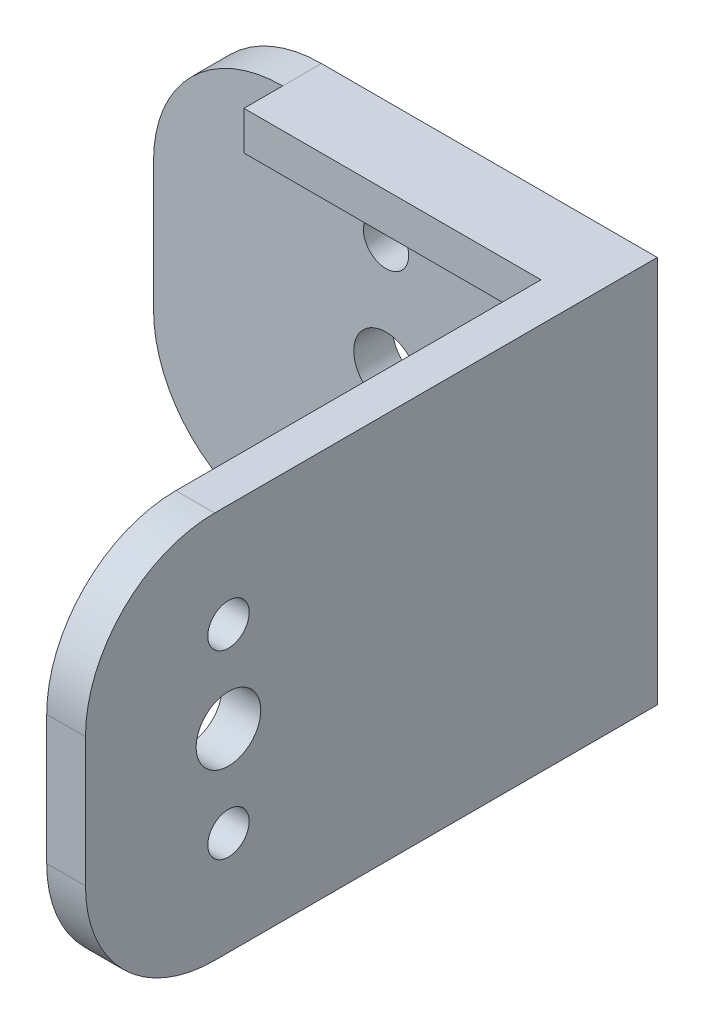
ISO-10303-21;
HEADER;
FILE_DESCRIPTION(('STEP AP214'),'2;1');
FILE_NAME('part.step','',(''),(''),'','','');
FILE_SCHEMA(('AUTOMOTIVE_DESIGN { 1 0 10303 214 1 1 1 1 }'));
ENDSEC;
DATA;
#1=APPLICATION_CONTEXT('core data for automotive mechanical design processes');
#2=APPLICATION_PROTOCOL_DEFINITION('international standard','automotive_design',2000,#1);
#3=PRODUCT_CONTEXT('',#1,'mechanical');
#4=PRODUCT('Part','Part','',(#3));
#5=PRODUCT_RELATED_PRODUCT_CATEGORY('part','',(#4));
#6=PRODUCT_DEFINITION_FORMATION('','',#4);
#7=PRODUCT_DEFINITION_CONTEXT('part definition',#1,'design');
#8=PRODUCT_DEFINITION('design','',#6,#7);
#9=PRODUCT_DEFINITION_SHAPE('','',#8);
#10=(LENGTH_UNIT() NAMED_UNIT(*) SI_UNIT(.MILLI.,.METRE.));
#11=(NAMED_UNIT(*) PLANE_ANGLE_UNIT() SI_UNIT($,.RADIAN.));
#12=(NAMED_UNIT(*) SI_UNIT($,.STERADIAN.) SOLID_ANGLE_UNIT());
#13=UNCERTAINTY_MEASURE_WITH_UNIT(LENGTH_MEASURE(1.E-05),#10,'distance_accuracy_value','');
#14=(GEOMETRIC_REPRESENTATION_CONTEXT(3) GLOBAL_UNCERTAINTY_ASSIGNED_CONTEXT((#13)) GLOBAL_UNIT_ASSIGNED_CONTEXT((#10,
#11,#12)) REPRESENTATION_CONTEXT('',''));
#15=CARTESIAN_POINT('',(0.,0.,0.));
#16=DIRECTION('',(0.,0.,1.));
#17=DIRECTION('',(1.,0.,0.));
#18=AXIS2_PLACEMENT_3D('',#15,#16,#17);
#19=CARTESIAN_POINT('',(33.,0.,41.27));
#20=DIRECTION('',(1.,0.,0.));
#21=DIRECTION('',(0.,0.,-1.));
#22=AXIS2_PLACEMENT_3D('',#19,#20,#21);
#23=PLANE('',#22);
#24=CARTESIAN_POINT('',(33.,22.,30.1978748806243));
#25=DIRECTION('',(1.,0.,0.));
#26=DIRECTION('',(0.,0.,-1.));
#27=AXIS2_PLACEMENT_3D('',#24,#25,#26);
#28=CIRCLE('',#27,1.6);
#29=CARTESIAN_POINT('',(33.,22.,28.5978748806243));
#30=VERTEX_POINT('',#29);
#31=EDGE_CURVE('E236',#30,#30,#28,.T.);
#32=ORIENTED_EDGE('',*,*,#31,.T.);
#33=EDGE_LOOP('',(#32));
#34=FACE_BOUND('',#33,.T.);
#35=CARTESIAN_POINT('',(33.,8.,30.1978748806243));
#36=DIRECTION('',(1.,0.,0.));
#37=DIRECTION('',(0.,0.,-1.));
#38=AXIS2_PLACEMENT_3D('',#35,#36,#37);
#39=CIRCLE('',#38,1.6);
#40=CARTESIAN_POINT('',(33.,8.,28.5978748806243));
#41=VERTEX_POINT('',#40);
#42=EDGE_CURVE('E233',#41,#41,#39,.T.);
#43=ORIENTED_EDGE('',*,*,#42,.T.);
#44=EDGE_LOOP('',(#43));
#45=FACE_BOUND('',#44,.T.);
#46=CARTESIAN_POINT('',(33.,15.,30.1978748806243));
#47=DIRECTION('',(1.,0.,0.));
#48=DIRECTION('',(0.,0.,-1.));
#49=AXIS2_PLACEMENT_3D('',#46,#47,#48);
#50=CIRCLE('',#49,2.49999999999999);
#51=CARTESIAN_POINT('',(33.,15.,27.6978748806243));
#52=VERTEX_POINT('',#51);
#53=EDGE_CURVE('E223',#52,#52,#50,.T.);
#54=ORIENTED_EDGE('',*,*,#53,.T.);
#55=EDGE_LOOP('',(#54));
#56=FACE_BOUND('',#55,.T.);
#57=DIRECTION('',(0.,0.,-1.));
#58=VECTOR('',#57,1.);
#59=CARTESIAN_POINT('',(33.,27.,3.));
#60=LINE('',#59,#58);
#61=CARTESIAN_POINT('',(33.,27.,3.));
#62=VERTEX_POINT('',#61);
#63=CARTESIAN_POINT('',(33.,27.,2.));
#64=VERTEX_POINT('',#63);
#65=EDGE_CURVE('E179',#62,#64,#60,.T.);
#66=ORIENTED_EDGE('',*,*,#65,.T.);
#67=DIRECTION('',(0.,-1.,0.));
#68=VECTOR('',#67,1.);
#69=CARTESIAN_POINT('',(33.,0.,2.));
#70=LINE('',#69,#68);
#71=CARTESIAN_POINT('',(33.,3.,2.));
#72=VERTEX_POINT('',#71);
#73=EDGE_CURVE('E268',#64,#72,#70,.T.);
#74=ORIENTED_EDGE('',*,*,#73,.T.);
#75=DIRECTION('',(0.,0.,-1.));
#76=VECTOR('',#75,1.);
#77=CARTESIAN_POINT('',(33.,3.,3.));
#78=LINE('',#77,#76);
#79=CARTESIAN_POINT('',(33.,3.,3.));
#80=VERTEX_POINT('',#79);
#81=EDGE_CURVE('E191',#80,#72,#78,.T.);
#82=ORIENTED_EDGE('',*,*,#81,.F.);
#83=DIRECTION('',(0.,1.,0.));
#84=VECTOR('',#83,1.);
#85=CARTESIAN_POINT('',(33.,0.,3.));
#86=LINE('',#85,#84);
#87=CARTESIAN_POINT('',(33.,0.,3.));
#88=VERTEX_POINT('',#87);
#89=EDGE_CURVE('E202',#88,#80,#86,.T.);
#90=ORIENTED_EDGE('',*,*,#89,.F.);
#91=DIRECTION('',(0.,0.,-1.));
#92=VECTOR('',#91,1.);
#93=CARTESIAN_POINT('',(33.,0.,41.27));
#94=LINE('',#93,#92);
#95=CARTESIAN_POINT('',(33.,0.,31.27));
#96=VERTEX_POINT('',#95);
#97=EDGE_CURVE('E264',#96,#88,#94,.T.);
#98=ORIENTED_EDGE('',*,*,#97,.F.);
#99=CARTESIAN_POINT('',(33.,10.,31.27));
#100=DIRECTION('',(1.,0.,0.));
#101=DIRECTION('',(0.,0.,-1.));
#102=AXIS2_PLACEMENT_3D('',#99,#100,#101);
#103=CIRCLE('',#102,10.);
#104=CARTESIAN_POINT('',(33.,10.,41.27));
#105=VERTEX_POINT('',#104);
#106=EDGE_CURVE('E305',#96,#105,#103,.F.);
#107=ORIENTED_EDGE('',*,*,#106,.T.);
#108=DIRECTION('',(0.,-1.,0.));
#109=VECTOR('',#108,1.);
#110=CARTESIAN_POINT('',(33.,0.,41.27));
#111=LINE('',#110,#109);
#112=CARTESIAN_POINT('',(33.,20.,41.27));
#113=VERTEX_POINT('',#112);
#114=EDGE_CURVE('E251',#113,#105,#111,.T.);
#115=ORIENTED_EDGE('',*,*,#114,.F.);
#116=CARTESIAN_POINT('',(33.,20.,31.27));
#117=DIRECTION('',(1.,0.,0.));
#118=DIRECTION('',(0.,0.,-1.));
#119=AXIS2_PLACEMENT_3D('',#116,#117,#118);
#120=CIRCLE('',#119,10.);
#121=CARTESIAN_POINT('',(33.,30.,31.27));
#122=VERTEX_POINT('',#121);
#123=EDGE_CURVE('E307',#113,#122,#120,.F.);
#124=ORIENTED_EDGE('',*,*,#123,.T.);
#125=DIRECTION('',(0.,0.,-1.));
#126=VECTOR('',#125,1.);
#127=CARTESIAN_POINT('',(33.,30.,41.27));
#128=LINE('',#127,#126);
#129=CARTESIAN_POINT('',(33.,30.,3.));
#130=VERTEX_POINT('',#129);
#131=EDGE_CURVE('E63',#122,#130,#128,.T.);
#132=ORIENTED_EDGE('',*,*,#131,.T.);
#133=DIRECTION('',(0.,1.,0.));
#134=VECTOR('',#133,1.);
#135=CARTESIAN_POINT('',(33.,30.,3.));
#136=LINE('',#135,#134);
#137=EDGE_CURVE('E58',#62,#130,#136,.T.);
#138=ORIENTED_EDGE('',*,*,#137,.F.);
#139=EDGE_LOOP('',(#66,#74,#82,#90,#98,#107,#115,#124,#132,#138));
#140=FACE_BOUND('',#139,.T.);
#141=ADVANCED_FACE('F43',(#34,#45,#56,#140),#23,.F.);
#142=CARTESIAN_POINT('',(0.,0.,0.));
#143=DIRECTION('',(0.,0.,-1.));
#144=DIRECTION('',(-1.,0.,0.));
#145=AXIS2_PLACEMENT_3D('',#142,#143,#144);
#146=PLANE('',#145);
#147=CARTESIAN_POINT('',(18.,23.5,0.));
#148=DIRECTION('',(0.,0.,-1.));
#149=DIRECTION('',(-1.,0.,0.));
#150=AXIS2_PLACEMENT_3D('',#147,#148,#149);
#151=CIRCLE('',#150,1.75);
#152=CARTESIAN_POINT('',(16.25,23.5,0.));
#153=VERTEX_POINT('',#152);
#154=EDGE_CURVE('E230',#153,#153,#151,.T.);
#155=ORIENTED_EDGE('',*,*,#154,.T.);
#156=EDGE_LOOP('',(#155));
#157=FACE_BOUND('',#156,.T.);
#158=CARTESIAN_POINT('',(18.,6.5,0.));
#159=DIRECTION('',(0.,0.,-1.));
#160=DIRECTION('',(-1.,0.,0.));
#161=AXIS2_PLACEMENT_3D('',#158,#159,#160);
#162=CIRCLE('',#161,1.75);
#163=CARTESIAN_POINT('',(16.25,6.5,0.));
#164=VERTEX_POINT('',#163);
#165=EDGE_CURVE('E311',#164,#164,#162,.T.);
#166=ORIENTED_EDGE('',*,*,#165,.T.);
#167=EDGE_LOOP('',(#166));
#168=FACE_BOUND('',#167,.T.);
#169=CARTESIAN_POINT('',(18.,15.,0.));
#170=DIRECTION('',(0.,0.,-1.));
#171=DIRECTION('',(-1.,0.,0.));
#172=AXIS2_PLACEMENT_3D('',#169,#170,#171);
#173=CIRCLE('',#172,2.49999999999999);
#174=CARTESIAN_POINT('',(15.5,15.,0.));
#175=VERTEX_POINT('',#174);
#176=EDGE_CURVE('E214',#175,#175,#173,.T.);
#177=ORIENTED_EDGE('',*,*,#176,.T.);
#178=EDGE_LOOP('',(#177));
#179=FACE_BOUND('',#178,.T.);
#180=DIRECTION('',(0.,-1.,0.));
#181=VECTOR('',#180,1.);
#182=CARTESIAN_POINT('',(10.,30.,0.));
#183=LINE('',#182,#181);
#184=CARTESIAN_POINT('',(10.,30.,0.));
#185=VERTEX_POINT('',#184);
#186=CARTESIAN_POINT('',(10.,27.,0.));
#187=VERTEX_POINT('',#186);
#188=EDGE_CURVE('E183',#185,#187,#183,.T.);
#189=ORIENTED_EDGE('',*,*,#188,.F.);
#190=CARTESIAN_POINT('',(10.,20.,0.));
#191=DIRECTION('',(0.,0.,-1.));
#192=DIRECTION('',(-1.,0.,0.));
#193=AXIS2_PLACEMENT_3D('',#190,#191,#192);
#194=CIRCLE('',#193,10.);
#195=CARTESIAN_POINT('',(0.,20.,0.));
#196=VERTEX_POINT('',#195);
#197=EDGE_CURVE('E281',#185,#196,#194,.F.);
#198=ORIENTED_EDGE('',*,*,#197,.T.);
#199=DIRECTION('',(0.,1.,0.));
#200=VECTOR('',#199,1.);
#201=CARTESIAN_POINT('',(0.,0.,0.));
#202=LINE('',#201,#200);
#203=CARTESIAN_POINT('',(0.,10.,0.));
#204=VERTEX_POINT('',#203);
#205=EDGE_CURVE('E239',#204,#196,#202,.T.);
#206=ORIENTED_EDGE('',*,*,#205,.F.);
#207=CARTESIAN_POINT('',(10.,10.,0.));
#208=DIRECTION('',(0.,0.,-1.));
#209=DIRECTION('',(-1.,0.,0.));
#210=AXIS2_PLACEMENT_3D('',#207,#208,#209);
#211=CIRCLE('',#210,10.);
#212=CARTESIAN_POINT('',(10.,0.,0.));
#213=VERTEX_POINT('',#212);
#214=EDGE_CURVE('E278',#204,#213,#211,.F.);
#215=ORIENTED_EDGE('',*,*,#214,.T.);
#216=DIRECTION('',(0.,-1.,0.));
#217=VECTOR('',#216,1.);
#218=CARTESIAN_POINT('',(10.,0.,0.));
#219=LINE('',#218,#217);
#220=CARTESIAN_POINT('',(10.,3.,0.));
#221=VERTEX_POINT('',#220);
#222=EDGE_CURVE('E200',#221,#213,#219,.T.);
#223=ORIENTED_EDGE('',*,*,#222,.F.);
#224=DIRECTION('',(-1.,0.,0.));
#225=VECTOR('',#224,1.);
#226=CARTESIAN_POINT('',(33.,3.,0.));
#227=LINE('',#226,#225);
#228=CARTESIAN_POINT('',(31.,3.,0.));
#229=VERTEX_POINT('',#228);
#230=EDGE_CURVE('E186',#229,#221,#227,.T.);
#231=ORIENTED_EDGE('',*,*,#230,.F.);
#232=DIRECTION('',(0.,-1.,0.));
#233=VECTOR('',#232,1.);
#234=CARTESIAN_POINT('',(31.,30.,0.));
#235=LINE('',#234,#233);
#236=CARTESIAN_POINT('',(31.,27.,0.));
#237=VERTEX_POINT('',#236);
#238=EDGE_CURVE('E271',#229,#237,#235,.F.);
#239=ORIENTED_EDGE('',*,*,#238,.T.);
#240=DIRECTION('',(1.,0.,0.));
#241=VECTOR('',#240,1.);
#242=CARTESIAN_POINT('',(10.,27.,0.));
#243=LINE('',#242,#241);
#244=EDGE_CURVE('E185',#187,#237,#243,.T.);
#245=ORIENTED_EDGE('',*,*,#244,.F.);
#246=EDGE_LOOP('',(#189,#198,#206,#215,#223,#231,#239,#245));
#247=FACE_BOUND('',#246,.T.);
#248=ADVANCED_FACE('F325',(#157,#168,#179,#247),#146,.F.);
#249=CARTESIAN_POINT('',(31.,0.,2.));
#250=DIRECTION('',(0.,1.,0.));
#251=DIRECTION('',(0.,0.,1.));
#252=AXIS2_PLACEMENT_3D('',#249,#250,#251);
#253=CYLINDRICAL_SURFACE('',#252,2.);
#254=CARTESIAN_POINT('',(31.,27.,2.));
#255=DIRECTION('',(0.,1.,0.));
#256=DIRECTION('',(0.,0.,1.));
#257=AXIS2_PLACEMENT_3D('',#254,#255,#256);
#258=CIRCLE('',#257,2.);
#259=EDGE_CURVE('E11',#237,#64,#258,.F.);
#260=ORIENTED_EDGE('',*,*,#259,.F.);
#261=ORIENTED_EDGE('',*,*,#238,.F.);
#262=CARTESIAN_POINT('',(31.,3.,2.));
#263=DIRECTION('',(0.,-1.,0.));
#264=DIRECTION('',(1.,0.,0.));
#265=AXIS2_PLACEMENT_3D('',#262,#263,#264);
#266=CIRCLE('',#265,2.);
#267=EDGE_CURVE('E51',#72,#229,#266,.F.);
#268=ORIENTED_EDGE('',*,*,#267,.F.);
#269=ORIENTED_EDGE('',*,*,#73,.F.);
#270=EDGE_LOOP('',(#260,#261,#268,#269));
#271=FACE_BOUND('',#270,.T.);
#272=ADVANCED_FACE('F326',(#271),#253,.F.);
#273=CARTESIAN_POINT('',(0.,30.,41.27));
#274=DIRECTION('',(0.,1.,0.));
#275=DIRECTION('',(0.,0.,1.));
#276=AXIS2_PLACEMENT_3D('',#273,#274,#275);
#277=PLANE('',#276);
#278=DIRECTION('',(-1.,0.,0.));
#279=VECTOR('',#278,1.);
#280=CARTESIAN_POINT('',(33.,30.,3.));
#281=LINE('',#280,#279);
#282=CARTESIAN_POINT('',(10.,30.,3.));
#283=VERTEX_POINT('',#282);
#284=EDGE_CURVE('E154',#130,#283,#281,.T.);
#285=ORIENTED_EDGE('',*,*,#284,.F.);
#286=ORIENTED_EDGE('',*,*,#131,.F.);
#287=DIRECTION('',(1.,0.,0.));
#288=VECTOR('',#287,1.);
#289=CARTESIAN_POINT('',(0.,30.,31.27));
#290=LINE('',#289,#288);
#291=CARTESIAN_POINT('',(36.,30.,31.27));
#292=VERTEX_POINT('',#291);
#293=EDGE_CURVE('E274',#122,#292,#290,.T.);
#294=ORIENTED_EDGE('',*,*,#293,.T.);
#295=DIRECTION('',(0.,0.,-1.));
#296=VECTOR('',#295,1.);
#297=CARTESIAN_POINT('',(36.,30.,41.27));
#298=LINE('',#297,#296);
#299=CARTESIAN_POINT('',(36.,30.,-3.));
#300=VERTEX_POINT('',#299);
#301=EDGE_CURVE('E259',#292,#300,#298,.T.);
#302=ORIENTED_EDGE('',*,*,#301,.T.);
#303=DIRECTION('',(1.,0.,0.));
#304=VECTOR('',#303,1.);
#305=CARTESIAN_POINT('',(0.,30.,-3.));
#306=LINE('',#305,#304);
#307=CARTESIAN_POINT('',(10.,30.,-3.));
#308=VERTEX_POINT('',#307);
#309=EDGE_CURVE('E243',#308,#300,#306,.T.);
#310=ORIENTED_EDGE('',*,*,#309,.F.);
#311=DIRECTION('',(0.,0.,1.));
#312=VECTOR('',#311,1.);
#313=CARTESIAN_POINT('',(10.,30.,0.));
#314=LINE('',#313,#312);
#315=EDGE_CURVE('E168',#308,#185,#314,.T.);
#316=ORIENTED_EDGE('',*,*,#315,.T.);
#317=DIRECTION('',(0.,0.,-1.));
#318=VECTOR('',#317,1.);
#319=CARTESIAN_POINT('',(10.,30.,3.));
#320=LINE('',#319,#318);
#321=EDGE_CURVE('E164',#283,#185,#320,.T.);
#322=ORIENTED_EDGE('',*,*,#321,.F.);
#323=EDGE_LOOP('',(#285,#286,#294,#302,#310,#316,#322));
#324=FACE_BOUND('',#323,.T.);
#325=ADVANCED_FACE('F165',(#324),#277,.T.);
#326=CARTESIAN_POINT('',(0.,0.,41.27));
#327=DIRECTION('',(0.,1.,0.));
#328=DIRECTION('',(0.,0.,1.));
#329=AXIS2_PLACEMENT_3D('',#326,#327,#328);
#330=PLANE('',#329);
#331=ORIENTED_EDGE('',*,*,#97,.T.);
#332=DIRECTION('',(1.,0.,0.));
#333=VECTOR('',#332,1.);
#334=CARTESIAN_POINT('',(33.,0.,3.));
#335=LINE('',#334,#333);
#336=CARTESIAN_POINT('',(10.,0.,3.));
#337=VERTEX_POINT('',#336);
#338=EDGE_CURVE('E199',#337,#88,#335,.T.);
#339=ORIENTED_EDGE('',*,*,#338,.F.);
#340=DIRECTION('',(0.,0.,-1.));
#341=VECTOR('',#340,1.);
#342=CARTESIAN_POINT('',(10.,0.,3.));
#343=LINE('',#342,#341);
#344=EDGE_CURVE('E196',#337,#213,#343,.T.);
#345=ORIENTED_EDGE('',*,*,#344,.T.);
#346=DIRECTION('',(0.,0.,1.));
#347=VECTOR('',#346,1.);
#348=CARTESIAN_POINT('',(10.,0.,41.27));
#349=LINE('',#348,#347);
#350=CARTESIAN_POINT('',(10.,0.,-3.));
#351=VERTEX_POINT('',#350);
#352=EDGE_CURVE('E294',#213,#351,#349,.F.);
#353=ORIENTED_EDGE('',*,*,#352,.T.);
#354=DIRECTION('',(1.,0.,0.));
#355=VECTOR('',#354,1.);
#356=CARTESIAN_POINT('',(0.,0.,-3.));
#357=LINE('',#356,#355);
#358=CARTESIAN_POINT('',(36.,0.,-3.));
#359=VERTEX_POINT('',#358);
#360=EDGE_CURVE('E248',#351,#359,#357,.T.);
#361=ORIENTED_EDGE('',*,*,#360,.T.);
#362=DIRECTION('',(0.,0.,-1.));
#363=VECTOR('',#362,1.);
#364=CARTESIAN_POINT('',(36.,0.,41.27));
#365=LINE('',#364,#363);
#366=CARTESIAN_POINT('',(36.,0.,31.27));
#367=VERTEX_POINT('',#366);
#368=EDGE_CURVE('E262',#367,#359,#365,.T.);
#369=ORIENTED_EDGE('',*,*,#368,.F.);
#370=DIRECTION('',(1.,0.,0.));
#371=VECTOR('',#370,1.);
#372=CARTESIAN_POINT('',(33.,0.,31.27));
#373=LINE('',#372,#371);
#374=EDGE_CURVE('E292',#367,#96,#373,.F.);
#375=ORIENTED_EDGE('',*,*,#374,.T.);
#376=EDGE_LOOP('',(#331,#339,#345,#353,#361,#369,#375));
#377=FACE_BOUND('',#376,.T.);
#378=ADVANCED_FACE('F349',(#377),#330,.F.);
#379=CARTESIAN_POINT('',(36.,0.,41.27));
#380=DIRECTION('',(-1.,0.,0.));
#381=DIRECTION('',(0.,0.,1.));
#382=AXIS2_PLACEMENT_3D('',#379,#380,#381);
#383=PLANE('',#382);
#384=CARTESIAN_POINT('',(36.,22.,30.1978748806243));
#385=DIRECTION('',(1.,0.,0.));
#386=DIRECTION('',(0.,0.,-1.));
#387=AXIS2_PLACEMENT_3D('',#384,#385,#386);
#388=CIRCLE('',#387,1.6);
#389=CARTESIAN_POINT('',(36.,22.,28.5978748806243));
#390=VERTEX_POINT('',#389);
#391=EDGE_CURVE('E220',#390,#390,#388,.T.);
#392=ORIENTED_EDGE('',*,*,#391,.F.);
#393=EDGE_LOOP('',(#392));
#394=FACE_BOUND('',#393,.T.);
#395=CARTESIAN_POINT('',(36.,8.,30.1978748806243));
#396=DIRECTION('',(1.,0.,0.));
#397=DIRECTION('',(0.,0.,-1.));
#398=AXIS2_PLACEMENT_3D('',#395,#396,#397);
#399=CIRCLE('',#398,1.6);
#400=CARTESIAN_POINT('',(36.,8.,28.5978748806243));
#401=VERTEX_POINT('',#400);
#402=EDGE_CURVE('E224',#401,#401,#399,.T.);
#403=ORIENTED_EDGE('',*,*,#402,.F.);
#404=EDGE_LOOP('',(#403));
#405=FACE_BOUND('',#404,.T.);
#406=CARTESIAN_POINT('',(36.,15.,30.1978748806243));
#407=DIRECTION('',(1.,0.,0.));
#408=DIRECTION('',(0.,0.,-1.));
#409=AXIS2_PLACEMENT_3D('',#406,#407,#408);
#410=CIRCLE('',#409,2.49999999999999);
#411=CARTESIAN_POINT('',(36.,15.,27.6978748806243));
#412=VERTEX_POINT('',#411);
#413=EDGE_CURVE('E227',#412,#412,#410,.T.);
#414=ORIENTED_EDGE('',*,*,#413,.F.);
#415=EDGE_LOOP('',(#414));
#416=FACE_BOUND('',#415,.T.);
#417=ORIENTED_EDGE('',*,*,#301,.F.);
#418=CARTESIAN_POINT('',(36.,20.,31.27));
#419=DIRECTION('',(-1.,0.,0.));
#420=DIRECTION('',(0.,0.,1.));
#421=AXIS2_PLACEMENT_3D('',#418,#419,#420);
#422=CIRCLE('',#421,10.);
#423=CARTESIAN_POINT('',(36.,20.,41.27));
#424=VERTEX_POINT('',#423);
#425=EDGE_CURVE('E298',#292,#424,#422,.F.);
#426=ORIENTED_EDGE('',*,*,#425,.T.);
#427=DIRECTION('',(0.,1.,0.));
#428=VECTOR('',#427,1.);
#429=CARTESIAN_POINT('',(36.,0.,41.27));
#430=LINE('',#429,#428);
#431=CARTESIAN_POINT('',(36.,10.,41.27));
#432=VERTEX_POINT('',#431);
#433=EDGE_CURVE('E256',#432,#424,#430,.T.);
#434=ORIENTED_EDGE('',*,*,#433,.F.);
#435=CARTESIAN_POINT('',(36.,10.,31.27));
#436=DIRECTION('',(-1.,0.,0.));
#437=DIRECTION('',(0.,0.,1.));
#438=AXIS2_PLACEMENT_3D('',#435,#436,#437);
#439=CIRCLE('',#438,10.);
#440=EDGE_CURVE('E296',#432,#367,#439,.F.);
#441=ORIENTED_EDGE('',*,*,#440,.T.);
#442=ORIENTED_EDGE('',*,*,#368,.T.);
#443=DIRECTION('',(0.,1.,0.));
#444=VECTOR('',#443,1.);
#445=CARTESIAN_POINT('',(36.,0.,-3.));
#446=LINE('',#445,#444);
#447=EDGE_CURVE('E245',#359,#300,#446,.T.);
#448=ORIENTED_EDGE('',*,*,#447,.T.);
#449=EDGE_LOOP('',(#417,#426,#434,#441,#442,#448));
#450=FACE_BOUND('',#449,.T.);
#451=ADVANCED_FACE('F396',(#394,#405,#416,#450),#383,.F.);
#452=CARTESIAN_POINT('',(0.,0.,41.27));
#453=DIRECTION('',(0.,0.,1.));
#454=DIRECTION('',(1.,0.,0.));
#455=AXIS2_PLACEMENT_3D('',#452,#453,#454);
#456=PLANE('',#455);
#457=ORIENTED_EDGE('',*,*,#433,.T.);
#458=DIRECTION('',(1.,0.,0.));
#459=VECTOR('',#458,1.);
#460=CARTESIAN_POINT('',(0.,20.,41.27));
#461=LINE('',#460,#459);
#462=EDGE_CURVE('E303',#424,#113,#461,.F.);
#463=ORIENTED_EDGE('',*,*,#462,.T.);
#464=ORIENTED_EDGE('',*,*,#114,.T.);
#465=DIRECTION('',(1.,0.,0.));
#466=VECTOR('',#465,1.);
#467=CARTESIAN_POINT('',(36.,10.,41.27));
#468=LINE('',#467,#466);
#469=EDGE_CURVE('E300',#105,#432,#468,.T.);
#470=ORIENTED_EDGE('',*,*,#469,.T.);
#471=EDGE_LOOP('',(#457,#463,#464,#470));
#472=FACE_BOUND('',#471,.T.);
#473=ADVANCED_FACE('F402',(#472),#456,.T.);
#474=CARTESIAN_POINT('',(0.,0.,-3.));
#475=DIRECTION('',(1.,0.,0.));
#476=DIRECTION('',(0.,0.,-1.));
#477=AXIS2_PLACEMENT_3D('',#474,#475,#476);
#478=PLANE('',#477);
#479=ORIENTED_EDGE('',*,*,#205,.T.);
#480=DIRECTION('',(0.,0.,1.));
#481=VECTOR('',#480,1.);
#482=CARTESIAN_POINT('',(0.,20.,-3.));
#483=LINE('',#482,#481);
#484=CARTESIAN_POINT('',(0.,20.,-3.));
#485=VERTEX_POINT('',#484);
#486=EDGE_CURVE('E286',#196,#485,#483,.F.);
#487=ORIENTED_EDGE('',*,*,#486,.T.);
#488=DIRECTION('',(0.,1.,0.));
#489=VECTOR('',#488,1.);
#490=CARTESIAN_POINT('',(0.,0.,-3.));
#491=LINE('',#490,#489);
#492=CARTESIAN_POINT('',(0.,10.,-3.));
#493=VERTEX_POINT('',#492);
#494=EDGE_CURVE('E240',#493,#485,#491,.T.);
#495=ORIENTED_EDGE('',*,*,#494,.F.);
#496=DIRECTION('',(0.,0.,1.));
#497=VECTOR('',#496,1.);
#498=CARTESIAN_POINT('',(0.,10.,-3.));
#499=LINE('',#498,#497);
#500=EDGE_CURVE('E283',#493,#204,#499,.T.);
#501=ORIENTED_EDGE('',*,*,#500,.T.);
#502=EDGE_LOOP('',(#479,#487,#495,#501));
#503=FACE_BOUND('',#502,.T.);
#504=ADVANCED_FACE('F338',(#503),#478,.F.);
#505=CARTESIAN_POINT('',(0.,0.,-3.));
#506=DIRECTION('',(0.,0.,-1.));
#507=DIRECTION('',(-1.,0.,0.));
#508=AXIS2_PLACEMENT_3D('',#505,#506,#507);
#509=PLANE('',#508);
#510=CARTESIAN_POINT('',(18.,23.5,-3.));
#511=DIRECTION('',(0.,0.,-1.));
#512=DIRECTION('',(-1.,0.,0.));
#513=AXIS2_PLACEMENT_3D('',#510,#511,#512);
#514=CIRCLE('',#513,1.75);
#515=CARTESIAN_POINT('',(16.25,23.5,-3.));
#516=VERTEX_POINT('',#515);
#517=EDGE_CURVE('E211',#516,#516,#514,.T.);
#518=ORIENTED_EDGE('',*,*,#517,.F.);
#519=EDGE_LOOP('',(#518));
#520=FACE_BOUND('',#519,.T.);
#521=CARTESIAN_POINT('',(18.,6.5,-3.));
#522=DIRECTION('',(0.,0.,-1.));
#523=DIRECTION('',(-1.,0.,0.));
#524=AXIS2_PLACEMENT_3D('',#521,#522,#523);
#525=CIRCLE('',#524,1.75);
#526=CARTESIAN_POINT('',(16.25,6.5,-3.));
#527=VERTEX_POINT('',#526);
#528=EDGE_CURVE('E215',#527,#527,#525,.T.);
#529=ORIENTED_EDGE('',*,*,#528,.F.);
#530=EDGE_LOOP('',(#529));
#531=FACE_BOUND('',#530,.T.);
#532=CARTESIAN_POINT('',(18.,15.,-3.));
#533=DIRECTION('',(0.,0.,-1.));
#534=DIRECTION('',(-1.,0.,0.));
#535=AXIS2_PLACEMENT_3D('',#532,#533,#534);
#536=CIRCLE('',#535,2.49999999999999);
#537=CARTESIAN_POINT('',(15.5,15.,-3.));
#538=VERTEX_POINT('',#537);
#539=EDGE_CURVE('E171',#538,#538,#536,.T.);
#540=ORIENTED_EDGE('',*,*,#539,.F.);
#541=EDGE_LOOP('',(#540));
#542=FACE_BOUND('',#541,.T.);
#543=ORIENTED_EDGE('',*,*,#494,.T.);
#544=CARTESIAN_POINT('',(10.,20.,-3.));
#545=DIRECTION('',(0.,0.,-1.));
#546=DIRECTION('',(-1.,0.,0.));
#547=AXIS2_PLACEMENT_3D('',#544,#545,#546);
#548=CIRCLE('',#547,10.);
#549=EDGE_CURVE('E290',#485,#308,#548,.T.);
#550=ORIENTED_EDGE('',*,*,#549,.T.);
#551=ORIENTED_EDGE('',*,*,#309,.T.);
#552=ORIENTED_EDGE('',*,*,#447,.F.);
#553=ORIENTED_EDGE('',*,*,#360,.F.);
#554=CARTESIAN_POINT('',(10.,10.,-3.));
#555=DIRECTION('',(0.,0.,-1.));
#556=DIRECTION('',(-1.,0.,0.));
#557=AXIS2_PLACEMENT_3D('',#554,#555,#556);
#558=CIRCLE('',#557,10.);
#559=EDGE_CURVE('E288',#351,#493,#558,.T.);
#560=ORIENTED_EDGE('',*,*,#559,.T.);
#561=EDGE_LOOP('',(#543,#550,#551,#552,#553,#560));
#562=FACE_BOUND('',#561,.T.);
#563=ADVANCED_FACE('F341',(#520,#531,#542,#562),#509,.T.);
#564=CARTESIAN_POINT('',(-49.,15.,30.1978748806243));
#565=DIRECTION('',(1.,0.,0.));
#566=DIRECTION('',(0.,0.,-1.));
#567=AXIS2_PLACEMENT_3D('',#564,#565,#566);
#568=CYLINDRICAL_SURFACE('',#567,2.49999999999999);
#569=ORIENTED_EDGE('',*,*,#413,.T.);
#570=EDGE_LOOP('',(#569));
#571=FACE_BOUND('',#570,.T.);
#572=ORIENTED_EDGE('',*,*,#53,.F.);
#573=EDGE_LOOP('',(#572));
#574=FACE_BOUND('',#573,.T.);
#575=ADVANCED_FACE('F413',(#571,#574),#568,.F.);
#576=CARTESIAN_POINT('',(-49.,8.,30.1978748806243));
#577=DIRECTION('',(1.,0.,0.));
#578=DIRECTION('',(0.,0.,-1.));
#579=AXIS2_PLACEMENT_3D('',#576,#577,#578);
#580=CYLINDRICAL_SURFACE('',#579,1.6);
#581=ORIENTED_EDGE('',*,*,#402,.T.);
#582=EDGE_LOOP('',(#581));
#583=FACE_BOUND('',#582,.T.);
#584=ORIENTED_EDGE('',*,*,#42,.F.);
#585=EDGE_LOOP('',(#584));
#586=FACE_BOUND('',#585,.T.);
#587=ADVANCED_FACE('F417',(#583,#586),#580,.F.);
#588=CARTESIAN_POINT('',(-49.,22.,30.1978748806243));
#589=DIRECTION('',(1.,0.,0.));
#590=DIRECTION('',(0.,0.,-1.));
#591=AXIS2_PLACEMENT_3D('',#588,#589,#590);
#592=CYLINDRICAL_SURFACE('',#591,1.6);
#593=ORIENTED_EDGE('',*,*,#391,.T.);
#594=EDGE_LOOP('',(#593));
#595=FACE_BOUND('',#594,.T.);
#596=ORIENTED_EDGE('',*,*,#31,.F.);
#597=EDGE_LOOP('',(#596));
#598=FACE_BOUND('',#597,.T.);
#599=ADVANCED_FACE('F379',(#595,#598),#592,.F.);
#600=CARTESIAN_POINT('',(10.,20.,41.27));
#601=DIRECTION('',(0.,0.,-1.));
#602=DIRECTION('',(-1.,0.,0.));
#603=AXIS2_PLACEMENT_3D('',#600,#601,#602);
#604=CYLINDRICAL_SURFACE('',#603,10.);
#605=ORIENTED_EDGE('',*,*,#549,.F.);
#606=ORIENTED_EDGE('',*,*,#486,.F.);
#607=ORIENTED_EDGE('',*,*,#197,.F.);
#608=ORIENTED_EDGE('',*,*,#315,.F.);
#609=EDGE_LOOP('',(#605,#606,#607,#608));
#610=FACE_BOUND('',#609,.T.);
#611=ADVANCED_FACE('F335',(#610),#604,.T.);
#612=CARTESIAN_POINT('',(10.,10.,-3.));
#613=DIRECTION('',(0.,0.,1.));
#614=DIRECTION('',(1.,0.,0.));
#615=AXIS2_PLACEMENT_3D('',#612,#613,#614);
#616=CYLINDRICAL_SURFACE('',#615,10.);
#617=ORIENTED_EDGE('',*,*,#559,.F.);
#618=ORIENTED_EDGE('',*,*,#352,.F.);
#619=ORIENTED_EDGE('',*,*,#214,.F.);
#620=ORIENTED_EDGE('',*,*,#500,.F.);
#621=EDGE_LOOP('',(#617,#618,#619,#620));
#622=FACE_BOUND('',#621,.T.);
#623=ADVANCED_FACE('F347',(#622),#616,.T.);
#624=CARTESIAN_POINT('',(0.,20.,31.27));
#625=DIRECTION('',(1.,0.,0.));
#626=DIRECTION('',(0.,0.,-1.));
#627=AXIS2_PLACEMENT_3D('',#624,#625,#626);
#628=CYLINDRICAL_SURFACE('',#627,10.);
#629=ORIENTED_EDGE('',*,*,#123,.F.);
#630=ORIENTED_EDGE('',*,*,#462,.F.);
#631=ORIENTED_EDGE('',*,*,#425,.F.);
#632=ORIENTED_EDGE('',*,*,#293,.F.);
#633=EDGE_LOOP('',(#629,#630,#631,#632));
#634=FACE_BOUND('',#633,.T.);
#635=ADVANCED_FACE('F381',(#634),#628,.T.);
#636=CARTESIAN_POINT('',(0.,10.,31.27));
#637=DIRECTION('',(-1.,0.,0.));
#638=DIRECTION('',(0.,0.,1.));
#639=AXIS2_PLACEMENT_3D('',#636,#637,#638);
#640=CYLINDRICAL_SURFACE('',#639,10.);
#641=ORIENTED_EDGE('',*,*,#106,.F.);
#642=ORIENTED_EDGE('',*,*,#374,.F.);
#643=ORIENTED_EDGE('',*,*,#440,.F.);
#644=ORIENTED_EDGE('',*,*,#469,.F.);
#645=EDGE_LOOP('',(#641,#642,#643,#644));
#646=FACE_BOUND('',#645,.T.);
#647=ADVANCED_FACE('F45',(#646),#640,.T.);
#648=CARTESIAN_POINT('',(18.,15.,7.));
#649=DIRECTION('',(0.,0.,-1.));
#650=DIRECTION('',(-1.,0.,0.));
#651=AXIS2_PLACEMENT_3D('',#648,#649,#650);
#652=CYLINDRICAL_SURFACE('',#651,2.49999999999999);
#653=ORIENTED_EDGE('',*,*,#539,.T.);
#654=EDGE_LOOP('',(#653));
#655=FACE_BOUND('',#654,.T.);
#656=ORIENTED_EDGE('',*,*,#176,.F.);
#657=EDGE_LOOP('',(#656));
#658=FACE_BOUND('',#657,.T.);
#659=ADVANCED_FACE('F388',(#655,#658),#652,.F.);
#660=CARTESIAN_POINT('',(18.,6.5,7.));
#661=DIRECTION('',(0.,0.,-1.));
#662=DIRECTION('',(-1.,0.,0.));
#663=AXIS2_PLACEMENT_3D('',#660,#661,#662);
#664=CYLINDRICAL_SURFACE('',#663,1.75);
#665=ORIENTED_EDGE('',*,*,#528,.T.);
#666=EDGE_LOOP('',(#665));
#667=FACE_BOUND('',#666,.T.);
#668=ORIENTED_EDGE('',*,*,#165,.F.);
#669=EDGE_LOOP('',(#668));
#670=FACE_BOUND('',#669,.T.);
#671=ADVANCED_FACE('F427',(#667,#670),#664,.F.);
#672=CARTESIAN_POINT('',(18.,23.5,7.));
#673=DIRECTION('',(0.,0.,-1.));
#674=DIRECTION('',(-1.,0.,0.));
#675=AXIS2_PLACEMENT_3D('',#672,#673,#674);
#676=CYLINDRICAL_SURFACE('',#675,1.75);
#677=ORIENTED_EDGE('',*,*,#517,.T.);
#678=EDGE_LOOP('',(#677));
#679=FACE_BOUND('',#678,.T.);
#680=ORIENTED_EDGE('',*,*,#154,.F.);
#681=EDGE_LOOP('',(#680));
#682=FACE_BOUND('',#681,.T.);
#683=ADVANCED_FACE('F431',(#679,#682),#676,.F.);
#684=CARTESIAN_POINT('',(33.,3.,3.));
#685=DIRECTION('',(0.,-1.,0.));
#686=DIRECTION('',(1.,0.,0.));
#687=AXIS2_PLACEMENT_3D('',#684,#685,#686);
#688=PLANE('',#687);
#689=ORIENTED_EDGE('',*,*,#81,.T.);
#690=ORIENTED_EDGE('',*,*,#267,.T.);
#691=ORIENTED_EDGE('',*,*,#230,.T.);
#692=DIRECTION('',(0.,0.,-1.));
#693=VECTOR('',#692,1.);
#694=CARTESIAN_POINT('',(10.,3.,3.));
#695=LINE('',#694,#693);
#696=CARTESIAN_POINT('',(10.,3.,3.));
#697=VERTEX_POINT('',#696);
#698=EDGE_CURVE('E193',#697,#221,#695,.T.);
#699=ORIENTED_EDGE('',*,*,#698,.F.);
#700=DIRECTION('',(-1.,0.,0.));
#701=VECTOR('',#700,1.);
#702=CARTESIAN_POINT('',(33.,3.,3.));
#703=LINE('',#702,#701);
#704=EDGE_CURVE('E207',#80,#697,#703,.T.);
#705=ORIENTED_EDGE('',*,*,#704,.F.);
#706=EDGE_LOOP('',(#689,#690,#691,#699,#705));
#707=FACE_BOUND('',#706,.T.);
#708=ADVANCED_FACE('F318',(#707),#688,.F.);
#709=CARTESIAN_POINT('',(10.,0.,3.));
#710=DIRECTION('',(1.,0.,0.));
#711=DIRECTION('',(0.,0.,-1.));
#712=AXIS2_PLACEMENT_3D('',#709,#710,#711);
#713=PLANE('',#712);
#714=ORIENTED_EDGE('',*,*,#222,.T.);
#715=ORIENTED_EDGE('',*,*,#344,.F.);
#716=DIRECTION('',(0.,-1.,0.));
#717=VECTOR('',#716,1.);
#718=CARTESIAN_POINT('',(10.,0.,3.));
#719=LINE('',#718,#717);
#720=EDGE_CURVE('E205',#697,#337,#719,.T.);
#721=ORIENTED_EDGE('',*,*,#720,.F.);
#722=ORIENTED_EDGE('',*,*,#698,.T.);
#723=EDGE_LOOP('',(#714,#715,#721,#722));
#724=FACE_BOUND('',#723,.T.);
#725=ADVANCED_FACE('F355',(#724),#713,.F.);
#726=CARTESIAN_POINT('',(0.,0.,3.));
#727=DIRECTION('',(0.,0.,1.));
#728=DIRECTION('',(1.,0.,0.));
#729=AXIS2_PLACEMENT_3D('',#726,#727,#728);
#730=PLANE('',#729);
#731=ORIENTED_EDGE('',*,*,#89,.T.);
#732=ORIENTED_EDGE('',*,*,#704,.T.);
#733=ORIENTED_EDGE('',*,*,#720,.T.);
#734=ORIENTED_EDGE('',*,*,#338,.T.);
#735=EDGE_LOOP('',(#731,#732,#733,#734));
#736=FACE_BOUND('',#735,.T.);
#737=ADVANCED_FACE('F358',(#736),#730,.T.);
#738=CARTESIAN_POINT('',(10.,27.,3.));
#739=DIRECTION('',(0.,1.,0.));
#740=DIRECTION('',(0.,0.,1.));
#741=AXIS2_PLACEMENT_3D('',#738,#739,#740);
#742=PLANE('',#741);
#743=ORIENTED_EDGE('',*,*,#244,.T.);
#744=ORIENTED_EDGE('',*,*,#259,.T.);
#745=ORIENTED_EDGE('',*,*,#65,.F.);
#746=DIRECTION('',(1.,0.,0.));
#747=VECTOR('',#746,1.);
#748=CARTESIAN_POINT('',(10.,27.,3.));
#749=LINE('',#748,#747);
#750=CARTESIAN_POINT('',(10.,27.,3.));
#751=VERTEX_POINT('',#750);
#752=EDGE_CURVE('E177',#751,#62,#749,.T.);
#753=ORIENTED_EDGE('',*,*,#752,.F.);
#754=DIRECTION('',(0.,0.,-1.));
#755=VECTOR('',#754,1.);
#756=CARTESIAN_POINT('',(10.,27.,3.));
#757=LINE('',#756,#755);
#758=EDGE_CURVE('E172',#751,#187,#757,.T.);
#759=ORIENTED_EDGE('',*,*,#758,.T.);
#760=EDGE_LOOP('',(#743,#744,#745,#753,#759));
#761=FACE_BOUND('',#760,.T.);
#762=ADVANCED_FACE('F329',(#761),#742,.F.);
#763=CARTESIAN_POINT('',(10.,30.,3.));
#764=DIRECTION('',(1.,0.,0.));
#765=DIRECTION('',(0.,0.,-1.));
#766=AXIS2_PLACEMENT_3D('',#763,#764,#765);
#767=PLANE('',#766);
#768=ORIENTED_EDGE('',*,*,#188,.T.);
#769=ORIENTED_EDGE('',*,*,#758,.F.);
#770=DIRECTION('',(0.,-1.,0.));
#771=VECTOR('',#770,1.);
#772=CARTESIAN_POINT('',(10.,30.,3.));
#773=LINE('',#772,#771);
#774=EDGE_CURVE('E158',#283,#751,#773,.T.);
#775=ORIENTED_EDGE('',*,*,#774,.F.);
#776=ORIENTED_EDGE('',*,*,#321,.T.);
#777=EDGE_LOOP('',(#768,#769,#775,#776));
#778=FACE_BOUND('',#777,.T.);
#779=ADVANCED_FACE('F174',(#778),#767,.F.);
#780=CARTESIAN_POINT('',(0.,0.,3.));
#781=DIRECTION('',(0.,0.,1.));
#782=DIRECTION('',(1.,0.,0.));
#783=AXIS2_PLACEMENT_3D('',#780,#781,#782);
#784=PLANE('',#783);
#785=ORIENTED_EDGE('',*,*,#137,.T.);
#786=ORIENTED_EDGE('',*,*,#284,.T.);
#787=ORIENTED_EDGE('',*,*,#774,.T.);
#788=ORIENTED_EDGE('',*,*,#752,.T.);
#789=EDGE_LOOP('',(#785,#786,#787,#788));
#790=FACE_BOUND('',#789,.T.);
#791=ADVANCED_FACE('F156',(#790),#784,.T.);
#792=CLOSED_SHELL('',(#141,#248,#272,#325,#378,#451,#473,#504,#563,#575,#587,#599,#611,#623,
#635,#647,#659,#671,#683,#708,#725,#737,#762,#779,#791));
#793=MANIFOLD_SOLID_BREP('B2',#792);
#794=ADVANCED_BREP_SHAPE_REPRESENTATION('',(#18,#793),#14);
#795=SHAPE_DEFINITION_REPRESENTATION(#9,#794);
ENDSEC;
END-ISO-10303-21;
